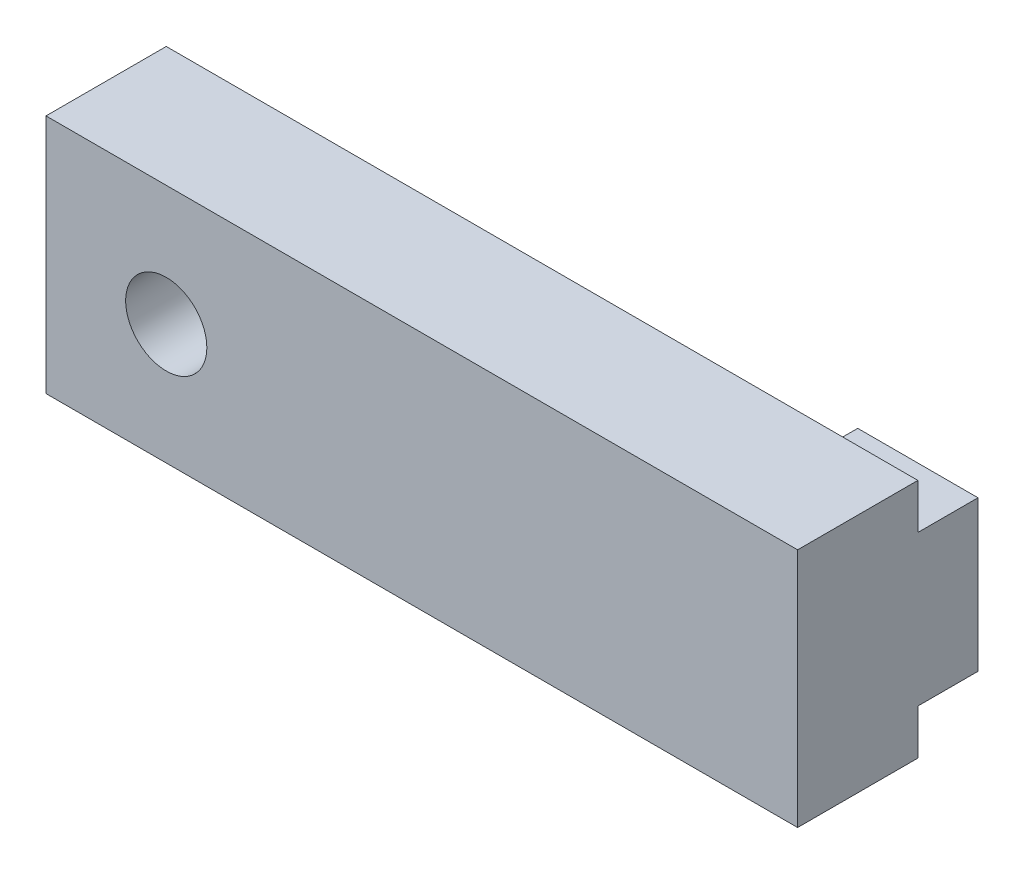
ISO-10303-21;
HEADER;
FILE_DESCRIPTION(('STEP AP214'),'2;1');
FILE_NAME('part.step','',(''),(''),'','','');
FILE_SCHEMA(('AUTOMOTIVE_DESIGN { 1 0 10303 214 1 1 1 1 }'));
ENDSEC;
DATA;
#1=APPLICATION_CONTEXT('core data for automotive mechanical design processes');
#2=APPLICATION_PROTOCOL_DEFINITION('international standard','automotive_design',2000,#1);
#3=PRODUCT_CONTEXT('',#1,'mechanical');
#4=PRODUCT('Part','Part','',(#3));
#5=PRODUCT_RELATED_PRODUCT_CATEGORY('part','',(#4));
#6=PRODUCT_DEFINITION_FORMATION('','',#4);
#7=PRODUCT_DEFINITION_CONTEXT('part definition',#1,'design');
#8=PRODUCT_DEFINITION('design','',#6,#7);
#9=PRODUCT_DEFINITION_SHAPE('','',#8);
#10=(LENGTH_UNIT() NAMED_UNIT(*) SI_UNIT(.MILLI.,.METRE.));
#11=(NAMED_UNIT(*) PLANE_ANGLE_UNIT() SI_UNIT($,.RADIAN.));
#12=(NAMED_UNIT(*) SI_UNIT($,.STERADIAN.) SOLID_ANGLE_UNIT());
#13=UNCERTAINTY_MEASURE_WITH_UNIT(LENGTH_MEASURE(1.E-05),#10,'distance_accuracy_value','');
#14=(GEOMETRIC_REPRESENTATION_CONTEXT(3) GLOBAL_UNCERTAINTY_ASSIGNED_CONTEXT((#13)) GLOBAL_UNIT_ASSIGNED_CONTEXT((#10,
#11,#12)) REPRESENTATION_CONTEXT('',''));
#15=CARTESIAN_POINT('',(0.,0.,0.));
#16=DIRECTION('',(0.,0.,1.));
#17=DIRECTION('',(1.,0.,0.));
#18=AXIS2_PLACEMENT_3D('',#15,#16,#17);
#19=CARTESIAN_POINT('',(0.,0.,0.));
#20=DIRECTION('',(0.,0.,-1.));
#21=DIRECTION('',(-1.,0.,0.));
#22=AXIS2_PLACEMENT_3D('',#19,#20,#21);
#23=PLANE('',#22);
#24=CARTESIAN_POINT('',(0.,0.,0.));
#25=DIRECTION('',(0.,0.,1.));
#26=DIRECTION('',(1.,0.,0.));
#27=AXIS2_PLACEMENT_3D('',#24,#25,#26);
#28=CIRCLE('',#27,2.7);
#29=CARTESIAN_POINT('',(2.7,0.,0.));
#30=VERTEX_POINT('',#29);
#31=EDGE_CURVE('E129',#30,#30,#28,.T.);
#32=ORIENTED_EDGE('',*,*,#31,.T.);
#33=EDGE_LOOP('',(#32));
#34=FACE_BOUND('',#33,.T.);
#35=DIRECTION('',(0.,-1.,0.));
#36=VECTOR('',#35,1.);
#37=CARTESIAN_POINT('',(34.,-5.,0.));
#38=LINE('',#37,#36);
#39=CARTESIAN_POINT('',(34.,5.,0.));
#40=VERTEX_POINT('',#39);
#41=CARTESIAN_POINT('',(34.,-5.,0.));
#42=VERTEX_POINT('',#41);
#43=EDGE_CURVE('E54',#40,#42,#38,.T.);
#44=ORIENTED_EDGE('',*,*,#43,.T.);
#45=DIRECTION('',(1.,0.,0.));
#46=VECTOR('',#45,1.);
#47=CARTESIAN_POINT('',(34.,-5.,0.));
#48=LINE('',#47,#46);
#49=CARTESIAN_POINT('',(42.,-5.,0.));
#50=VERTEX_POINT('',#49);
#51=EDGE_CURVE('E115',#42,#50,#48,.T.);
#52=ORIENTED_EDGE('',*,*,#51,.T.);
#53=DIRECTION('',(0.,1.,0.));
#54=VECTOR('',#53,1.);
#55=CARTESIAN_POINT('',(42.,-8.,0.));
#56=LINE('',#55,#54);
#57=CARTESIAN_POINT('',(42.,-8.,0.));
#58=VERTEX_POINT('',#57);
#59=EDGE_CURVE('E168',#58,#50,#56,.T.);
#60=ORIENTED_EDGE('',*,*,#59,.F.);
#61=DIRECTION('',(1.,0.,0.));
#62=VECTOR('',#61,1.);
#63=CARTESIAN_POINT('',(-8.,-8.,0.));
#64=LINE('',#63,#62);
#65=CARTESIAN_POINT('',(-8.,-8.,0.));
#66=VERTEX_POINT('',#65);
#67=EDGE_CURVE('E165',#66,#58,#64,.T.);
#68=ORIENTED_EDGE('',*,*,#67,.F.);
#69=DIRECTION('',(0.,-1.,0.));
#70=VECTOR('',#69,1.);
#71=CARTESIAN_POINT('',(-8.,-8.,0.));
#72=LINE('',#71,#70);
#73=CARTESIAN_POINT('',(-8.,8.,0.));
#74=VERTEX_POINT('',#73);
#75=EDGE_CURVE('E153',#74,#66,#72,.T.);
#76=ORIENTED_EDGE('',*,*,#75,.F.);
#77=DIRECTION('',(-1.,0.,0.));
#78=VECTOR('',#77,1.);
#79=CARTESIAN_POINT('',(-8.,8.,0.));
#80=LINE('',#79,#78);
#81=CARTESIAN_POINT('',(42.,8.,0.));
#82=VERTEX_POINT('',#81);
#83=EDGE_CURVE('E84',#82,#74,#80,.T.);
#84=ORIENTED_EDGE('',*,*,#83,.F.);
#85=CARTESIAN_POINT('',(42.,5.,0.));
#86=VERTEX_POINT('',#85);
#87=EDGE_CURVE('E167',#86,#82,#56,.T.);
#88=ORIENTED_EDGE('',*,*,#87,.F.);
#89=DIRECTION('',(-1.,0.,0.));
#90=VECTOR('',#89,1.);
#91=CARTESIAN_POINT('',(34.,5.,0.));
#92=LINE('',#91,#90);
#93=EDGE_CURVE('E124',#86,#40,#92,.T.);
#94=ORIENTED_EDGE('',*,*,#93,.T.);
#95=EDGE_LOOP('',(#44,#52,#60,#68,#76,#84,#88,#94));
#96=FACE_BOUND('',#95,.T.);
#97=ADVANCED_FACE('F39',(#34,#96),#23,.T.);
#98=CARTESIAN_POINT('',(-8.,-8.,8.));
#99=DIRECTION('',(1.,0.,0.));
#100=DIRECTION('',(0.,0.,-1.));
#101=AXIS2_PLACEMENT_3D('',#98,#99,#100);
#102=PLANE('',#101);
#103=ORIENTED_EDGE('',*,*,#75,.T.);
#104=DIRECTION('',(0.,0.,-1.));
#105=VECTOR('',#104,1.);
#106=CARTESIAN_POINT('',(-8.,-8.,8.));
#107=LINE('',#106,#105);
#108=CARTESIAN_POINT('',(-8.,-8.,8.));
#109=VERTEX_POINT('',#108);
#110=EDGE_CURVE('E11',#109,#66,#107,.T.);
#111=ORIENTED_EDGE('',*,*,#110,.F.);
#112=DIRECTION('',(0.,-1.,0.));
#113=VECTOR('',#112,1.);
#114=CARTESIAN_POINT('',(-8.,-8.,8.));
#115=LINE('',#114,#113);
#116=CARTESIAN_POINT('',(-8.,8.,8.));
#117=VERTEX_POINT('',#116);
#118=EDGE_CURVE('E156',#117,#109,#115,.T.);
#119=ORIENTED_EDGE('',*,*,#118,.F.);
#120=DIRECTION('',(0.,0.,-1.));
#121=VECTOR('',#120,1.);
#122=CARTESIAN_POINT('',(-8.,8.,8.));
#123=LINE('',#122,#121);
#124=EDGE_CURVE('E162',#117,#74,#123,.T.);
#125=ORIENTED_EDGE('',*,*,#124,.T.);
#126=EDGE_LOOP('',(#103,#111,#119,#125));
#127=FACE_BOUND('',#126,.T.);
#128=ADVANCED_FACE('F41',(#127),#102,.F.);
#129=CARTESIAN_POINT('',(-8.,-8.,8.));
#130=DIRECTION('',(0.,1.,0.));
#131=DIRECTION('',(0.,0.,1.));
#132=AXIS2_PLACEMENT_3D('',#129,#130,#131);
#133=PLANE('',#132);
#134=ORIENTED_EDGE('',*,*,#67,.T.);
#135=DIRECTION('',(0.,0.,-1.));
#136=VECTOR('',#135,1.);
#137=CARTESIAN_POINT('',(42.,-8.,8.));
#138=LINE('',#137,#136);
#139=CARTESIAN_POINT('',(42.,-8.,8.));
#140=VERTEX_POINT('',#139);
#141=EDGE_CURVE('E47',#140,#58,#138,.T.);
#142=ORIENTED_EDGE('',*,*,#141,.F.);
#143=DIRECTION('',(1.,0.,0.));
#144=VECTOR('',#143,1.);
#145=CARTESIAN_POINT('',(-8.,-8.,8.));
#146=LINE('',#145,#144);
#147=EDGE_CURVE('E91',#109,#140,#146,.T.);
#148=ORIENTED_EDGE('',*,*,#147,.F.);
#149=ORIENTED_EDGE('',*,*,#110,.T.);
#150=EDGE_LOOP('',(#134,#142,#148,#149));
#151=FACE_BOUND('',#150,.T.);
#152=ADVANCED_FACE('F180',(#151),#133,.F.);
#153=CARTESIAN_POINT('',(42.,-8.,8.));
#154=DIRECTION('',(-1.,0.,0.));
#155=DIRECTION('',(0.,0.,1.));
#156=AXIS2_PLACEMENT_3D('',#153,#154,#155);
#157=PLANE('',#156);
#158=ORIENTED_EDGE('',*,*,#59,.T.);
#159=DIRECTION('',(0.,0.,-1.));
#160=VECTOR('',#159,1.);
#161=CARTESIAN_POINT('',(42.,-5.,0.));
#162=LINE('',#161,#160);
#163=CARTESIAN_POINT('',(42.,-5.,-4.));
#164=VERTEX_POINT('',#163);
#165=EDGE_CURVE('E120',#50,#164,#162,.T.);
#166=ORIENTED_EDGE('',*,*,#165,.T.);
#167=DIRECTION('',(0.,1.,0.));
#168=VECTOR('',#167,1.);
#169=CARTESIAN_POINT('',(42.,-5.,-4.));
#170=LINE('',#169,#168);
#171=CARTESIAN_POINT('',(42.,5.,-4.));
#172=VERTEX_POINT('',#171);
#173=EDGE_CURVE('E136',#164,#172,#170,.T.);
#174=ORIENTED_EDGE('',*,*,#173,.T.);
#175=DIRECTION('',(0.,0.,-1.));
#176=VECTOR('',#175,1.);
#177=CARTESIAN_POINT('',(42.,5.,0.));
#178=LINE('',#177,#176);
#179=EDGE_CURVE('E146',#86,#172,#178,.T.);
#180=ORIENTED_EDGE('',*,*,#179,.F.);
#181=ORIENTED_EDGE('',*,*,#87,.T.);
#182=DIRECTION('',(0.,0.,-1.));
#183=VECTOR('',#182,1.);
#184=CARTESIAN_POINT('',(42.,8.,8.));
#185=LINE('',#184,#183);
#186=CARTESIAN_POINT('',(42.,8.,8.));
#187=VERTEX_POINT('',#186);
#188=EDGE_CURVE('E172',#187,#82,#185,.T.);
#189=ORIENTED_EDGE('',*,*,#188,.F.);
#190=DIRECTION('',(0.,1.,0.));
#191=VECTOR('',#190,1.);
#192=CARTESIAN_POINT('',(42.,-8.,8.));
#193=LINE('',#192,#191);
#194=EDGE_CURVE('E159',#140,#187,#193,.T.);
#195=ORIENTED_EDGE('',*,*,#194,.F.);
#196=ORIENTED_EDGE('',*,*,#141,.T.);
#197=EDGE_LOOP('',(#158,#166,#174,#180,#181,#189,#195,#196));
#198=FACE_BOUND('',#197,.T.);
#199=ADVANCED_FACE('F176',(#198),#157,.F.);
#200=CARTESIAN_POINT('',(-8.,8.,8.));
#201=DIRECTION('',(0.,-1.,0.));
#202=DIRECTION('',(0.,0.,-1.));
#203=AXIS2_PLACEMENT_3D('',#200,#201,#202);
#204=PLANE('',#203);
#205=ORIENTED_EDGE('',*,*,#83,.T.);
#206=ORIENTED_EDGE('',*,*,#124,.F.);
#207=DIRECTION('',(-1.,0.,0.));
#208=VECTOR('',#207,1.);
#209=CARTESIAN_POINT('',(-8.,8.,8.));
#210=LINE('',#209,#208);
#211=EDGE_CURVE('E63',#187,#117,#210,.T.);
#212=ORIENTED_EDGE('',*,*,#211,.F.);
#213=ORIENTED_EDGE('',*,*,#188,.T.);
#214=EDGE_LOOP('',(#205,#206,#212,#213));
#215=FACE_BOUND('',#214,.T.);
#216=ADVANCED_FACE('F183',(#215),#204,.F.);
#217=CARTESIAN_POINT('',(0.,0.,8.));
#218=DIRECTION('',(0.,0.,-1.));
#219=DIRECTION('',(-1.,0.,0.));
#220=AXIS2_PLACEMENT_3D('',#217,#218,#219);
#221=PLANE('',#220);
#222=CARTESIAN_POINT('',(0.,0.,8.));
#223=DIRECTION('',(0.,0.,1.));
#224=DIRECTION('',(1.,0.,0.));
#225=AXIS2_PLACEMENT_3D('',#222,#223,#224);
#226=CIRCLE('',#225,2.7);
#227=CARTESIAN_POINT('',(2.7,0.,8.));
#228=VERTEX_POINT('',#227);
#229=EDGE_CURVE('E150',#228,#228,#226,.T.);
#230=ORIENTED_EDGE('',*,*,#229,.F.);
#231=EDGE_LOOP('',(#230));
#232=FACE_BOUND('',#231,.T.);
#233=ORIENTED_EDGE('',*,*,#118,.T.);
#234=ORIENTED_EDGE('',*,*,#147,.T.);
#235=ORIENTED_EDGE('',*,*,#194,.T.);
#236=ORIENTED_EDGE('',*,*,#211,.T.);
#237=EDGE_LOOP('',(#233,#234,#235,#236));
#238=FACE_BOUND('',#237,.T.);
#239=ADVANCED_FACE('F206',(#232,#238),#221,.F.);
#240=CARTESIAN_POINT('',(0.,0.,8.));
#241=DIRECTION('',(0.,0.,-1.));
#242=DIRECTION('',(-1.,0.,0.));
#243=AXIS2_PLACEMENT_3D('',#240,#241,#242);
#244=CYLINDRICAL_SURFACE('',#243,2.7);
#245=ORIENTED_EDGE('',*,*,#229,.T.);
#246=EDGE_LOOP('',(#245));
#247=FACE_BOUND('',#246,.T.);
#248=ORIENTED_EDGE('',*,*,#31,.F.);
#249=EDGE_LOOP('',(#248));
#250=FACE_BOUND('',#249,.T.);
#251=ADVANCED_FACE('F227',(#247,#250),#244,.F.);
#252=CARTESIAN_POINT('',(34.,-5.,0.));
#253=DIRECTION('',(1.,0.,0.));
#254=DIRECTION('',(0.,0.,-1.));
#255=AXIS2_PLACEMENT_3D('',#252,#253,#254);
#256=PLANE('',#255);
#257=DIRECTION('',(0.,-1.,0.));
#258=VECTOR('',#257,1.);
#259=CARTESIAN_POINT('',(34.,-5.,-4.));
#260=LINE('',#259,#258);
#261=CARTESIAN_POINT('',(34.,5.,-4.));
#262=VERTEX_POINT('',#261);
#263=CARTESIAN_POINT('',(34.,-5.,-4.));
#264=VERTEX_POINT('',#263);
#265=EDGE_CURVE('E128',#262,#264,#260,.T.);
#266=ORIENTED_EDGE('',*,*,#265,.T.);
#267=DIRECTION('',(0.,0.,-1.));
#268=VECTOR('',#267,1.);
#269=CARTESIAN_POINT('',(34.,-5.,0.));
#270=LINE('',#269,#268);
#271=EDGE_CURVE('E117',#42,#264,#270,.T.);
#272=ORIENTED_EDGE('',*,*,#271,.F.);
#273=ORIENTED_EDGE('',*,*,#43,.F.);
#274=DIRECTION('',(0.,0.,-1.));
#275=VECTOR('',#274,1.);
#276=CARTESIAN_POINT('',(34.,5.,0.));
#277=LINE('',#276,#275);
#278=EDGE_CURVE('E140',#40,#262,#277,.T.);
#279=ORIENTED_EDGE('',*,*,#278,.T.);
#280=EDGE_LOOP('',(#266,#272,#273,#279));
#281=FACE_BOUND('',#280,.T.);
#282=ADVANCED_FACE('F126',(#281),#256,.F.);
#283=CARTESIAN_POINT('',(34.,-5.,0.));
#284=DIRECTION('',(0.,1.,0.));
#285=DIRECTION('',(0.,0.,1.));
#286=AXIS2_PLACEMENT_3D('',#283,#284,#285);
#287=PLANE('',#286);
#288=DIRECTION('',(1.,0.,0.));
#289=VECTOR('',#288,1.);
#290=CARTESIAN_POINT('',(34.,-5.,-4.));
#291=LINE('',#290,#289);
#292=EDGE_CURVE('E142',#264,#164,#291,.T.);
#293=ORIENTED_EDGE('',*,*,#292,.T.);
#294=ORIENTED_EDGE('',*,*,#165,.F.);
#295=ORIENTED_EDGE('',*,*,#51,.F.);
#296=ORIENTED_EDGE('',*,*,#271,.T.);
#297=EDGE_LOOP('',(#293,#294,#295,#296));
#298=FACE_BOUND('',#297,.T.);
#299=ADVANCED_FACE('F116',(#298),#287,.F.);
#300=CARTESIAN_POINT('',(34.,5.,0.));
#301=DIRECTION('',(0.,-1.,0.));
#302=DIRECTION('',(0.,0.,-1.));
#303=AXIS2_PLACEMENT_3D('',#300,#301,#302);
#304=PLANE('',#303);
#305=DIRECTION('',(-1.,0.,0.));
#306=VECTOR('',#305,1.);
#307=CARTESIAN_POINT('',(34.,5.,-4.));
#308=LINE('',#307,#306);
#309=EDGE_CURVE('E134',#172,#262,#308,.T.);
#310=ORIENTED_EDGE('',*,*,#309,.T.);
#311=ORIENTED_EDGE('',*,*,#278,.F.);
#312=ORIENTED_EDGE('',*,*,#93,.F.);
#313=ORIENTED_EDGE('',*,*,#179,.T.);
#314=EDGE_LOOP('',(#310,#311,#312,#313));
#315=FACE_BOUND('',#314,.T.);
#316=ADVANCED_FACE('F187',(#315),#304,.F.);
#317=CARTESIAN_POINT('',(0.,0.,-4.));
#318=DIRECTION('',(0.,0.,-1.));
#319=DIRECTION('',(-1.,0.,0.));
#320=AXIS2_PLACEMENT_3D('',#317,#318,#319);
#321=PLANE('',#320);
#322=ORIENTED_EDGE('',*,*,#265,.F.);
#323=ORIENTED_EDGE('',*,*,#309,.F.);
#324=ORIENTED_EDGE('',*,*,#173,.F.);
#325=ORIENTED_EDGE('',*,*,#292,.F.);
#326=EDGE_LOOP('',(#322,#323,#324,#325));
#327=FACE_BOUND('',#326,.T.);
#328=ADVANCED_FACE('F189',(#327),#321,.T.);
#329=CLOSED_SHELL('',(#97,#128,#152,#199,#216,#239,#251,#282,#299,#316,#328));
#330=MANIFOLD_SOLID_BREP('B2',#329);
#331=ADVANCED_BREP_SHAPE_REPRESENTATION('',(#18,#330),#14);
#332=SHAPE_DEFINITION_REPRESENTATION(#9,#331);
ENDSEC;
END-ISO-10303-21;
